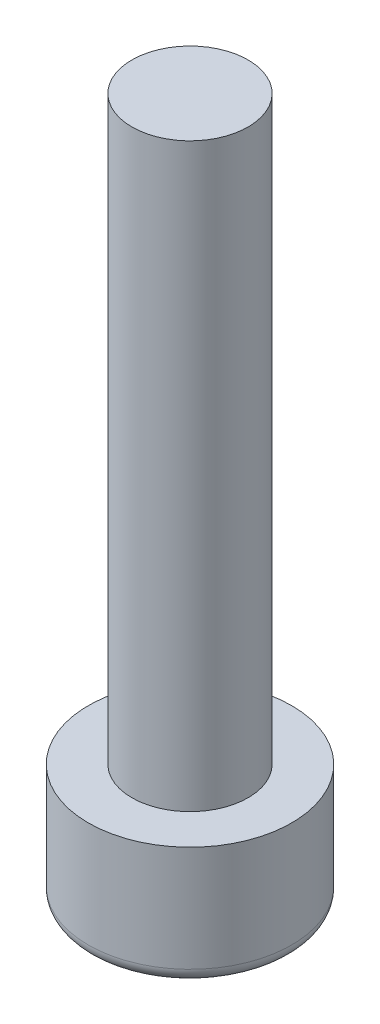
ISO-10303-21;
HEADER;
FILE_DESCRIPTION(('STEP AP214'),'2;1');
FILE_NAME('part.step','',(''),(''),'','','');
FILE_SCHEMA(('AUTOMOTIVE_DESIGN { 1 0 10303 214 1 1 1 1 }'));
ENDSEC;
DATA;
#1=APPLICATION_CONTEXT('core data for automotive mechanical design processes');
#2=APPLICATION_PROTOCOL_DEFINITION('international standard','automotive_design',2000,#1);
#3=PRODUCT_CONTEXT('',#1,'mechanical');
#4=PRODUCT('Part','Part','',(#3));
#5=PRODUCT_RELATED_PRODUCT_CATEGORY('part','',(#4));
#6=PRODUCT_DEFINITION_FORMATION('','',#4);
#7=PRODUCT_DEFINITION_CONTEXT('part definition',#1,'design');
#8=PRODUCT_DEFINITION('design','',#6,#7);
#9=PRODUCT_DEFINITION_SHAPE('','',#8);
#10=(LENGTH_UNIT() NAMED_UNIT(*) SI_UNIT(.MILLI.,.METRE.));
#11=(NAMED_UNIT(*) PLANE_ANGLE_UNIT() SI_UNIT($,.RADIAN.));
#12=(NAMED_UNIT(*) SI_UNIT($,.STERADIAN.) SOLID_ANGLE_UNIT());
#13=UNCERTAINTY_MEASURE_WITH_UNIT(LENGTH_MEASURE(1.E-05),#10,'distance_accuracy_value','');
#14=(GEOMETRIC_REPRESENTATION_CONTEXT(3) GLOBAL_UNCERTAINTY_ASSIGNED_CONTEXT((#13)) GLOBAL_UNIT_ASSIGNED_CONTEXT((#10,
#11,#12)) REPRESENTATION_CONTEXT('',''));
#15=CARTESIAN_POINT('',(0.,0.,0.));
#16=DIRECTION('',(0.,0.,1.));
#17=DIRECTION('',(1.,0.,0.));
#18=AXIS2_PLACEMENT_3D('',#15,#16,#17);
#19=CARTESIAN_POINT('',(0.,4.14,0.));
#20=DIRECTION('',(0.,-1.,0.));
#21=DIRECTION('',(0.,0.,-1.));
#22=AXIS2_PLACEMENT_3D('',#19,#20,#21);
#23=CYLINDRICAL_SURFACE('',#22,3.5);
#24=CARTESIAN_POINT('',(0.,0.5,0.));
#25=DIRECTION('',(0.,1.,0.));
#26=DIRECTION('',(0.,0.,1.));
#27=AXIS2_PLACEMENT_3D('',#24,#25,#26);
#28=CIRCLE('',#27,3.5);
#29=CARTESIAN_POINT('',(0.,0.5,3.5));
#30=VERTEX_POINT('',#29);
#31=EDGE_CURVE('E47',#30,#30,#28,.T.);
#32=ORIENTED_EDGE('',*,*,#31,.T.);
#33=EDGE_LOOP('',(#32));
#34=FACE_BOUND('',#33,.T.);
#35=CARTESIAN_POINT('',(0.,4.14,0.));
#36=DIRECTION('',(0.,1.,0.));
#37=DIRECTION('',(0.,0.,1.));
#38=AXIS2_PLACEMENT_3D('',#35,#36,#37);
#39=CIRCLE('',#38,3.5);
#40=CARTESIAN_POINT('',(0.,4.14,3.5));
#41=VERTEX_POINT('',#40);
#42=EDGE_CURVE('E149',#41,#41,#39,.T.);
#43=ORIENTED_EDGE('',*,*,#42,.F.);
#44=EDGE_LOOP('',(#43));
#45=FACE_BOUND('',#44,.T.);
#46=ADVANCED_FACE('F39',(#34,#45),#23,.T.);
#47=CARTESIAN_POINT('',(0.,4.14,0.));
#48=DIRECTION('',(0.,1.,0.));
#49=DIRECTION('',(0.,0.,1.));
#50=AXIS2_PLACEMENT_3D('',#47,#48,#49);
#51=PLANE('',#50);
#52=CARTESIAN_POINT('',(0.,4.14,0.));
#53=DIRECTION('',(0.,1.,0.));
#54=DIRECTION('',(0.,0.,1.));
#55=AXIS2_PLACEMENT_3D('',#52,#53,#54);
#56=CIRCLE('',#55,2.);
#57=CARTESIAN_POINT('',(0.,4.14,2.));
#58=VERTEX_POINT('',#57);
#59=EDGE_CURVE('E150',#58,#58,#56,.T.);
#60=ORIENTED_EDGE('',*,*,#59,.F.);
#61=EDGE_LOOP('',(#60));
#62=FACE_BOUND('',#61,.T.);
#63=ORIENTED_EDGE('',*,*,#42,.T.);
#64=EDGE_LOOP('',(#63));
#65=FACE_BOUND('',#64,.T.);
#66=ADVANCED_FACE('F174',(#62,#65),#51,.T.);
#67=CARTESIAN_POINT('',(0.,0.,0.));
#68=DIRECTION('',(0.,1.,0.));
#69=DIRECTION('',(0.,0.,1.));
#70=AXIS2_PLACEMENT_3D('',#67,#68,#69);
#71=PLANE('',#70);
#72=DIRECTION('',(-0.986123142284574,0.,0.1660155060553));
#73=VECTOR('',#72,1.);
#74=CARTESIAN_POINT('',(1.69828720758972,0.,2.05607243390784));
#75=LINE('',#74,#73);
#76=CARTESIAN_POINT('',(1.69828720758972,0.,2.05607243390784));
#77=VERTEX_POINT('',#76);
#78=CARTESIAN_POINT('',(-0.931467355990228,0.,2.49879608164875));
#79=VERTEX_POINT('',#78);
#80=EDGE_CURVE('E128',#77,#79,#75,.T.);
#81=ORIENTED_EDGE('',*,*,#80,.F.);
#82=DIRECTION('',(-0.349287925476268,0.,0.937015445505828));
#83=VECTOR('',#82,1.);
#84=CARTESIAN_POINT('',(2.62975456357995,0.,-0.442723647740915));
#85=LINE('',#84,#83);
#86=CARTESIAN_POINT('',(2.62975456357995,0.,-0.442723647740915));
#87=VERTEX_POINT('',#86);
#88=EDGE_CURVE('E54',#87,#77,#85,.T.);
#89=ORIENTED_EDGE('',*,*,#88,.F.);
#90=DIRECTION('',(0.636835216808306,0.,0.770999939450528));
#91=VECTOR('',#90,1.);
#92=CARTESIAN_POINT('',(0.931467355990229,0.,-2.49879608164875));
#93=LINE('',#92,#91);
#94=CARTESIAN_POINT('',(0.931467355990229,0.,-2.49879608164875));
#95=VERTEX_POINT('',#94);
#96=EDGE_CURVE('E137',#95,#87,#93,.T.);
#97=ORIENTED_EDGE('',*,*,#96,.F.);
#98=DIRECTION('',(0.986123142284574,0.,-0.1660155060553));
#99=VECTOR('',#98,1.);
#100=CARTESIAN_POINT('',(-1.69828720758972,0.,-2.05607243390784));
#101=LINE('',#100,#99);
#102=CARTESIAN_POINT('',(-1.69828720758972,0.,-2.05607243390784));
#103=VERTEX_POINT('',#102);
#104=EDGE_CURVE('E135',#103,#95,#101,.T.);
#105=ORIENTED_EDGE('',*,*,#104,.F.);
#106=DIRECTION('',(0.349287925476268,0.,-0.937015445505828));
#107=VECTOR('',#106,1.);
#108=CARTESIAN_POINT('',(-2.62975456357995,0.,0.442723647740914));
#109=LINE('',#108,#107);
#110=CARTESIAN_POINT('',(-2.62975456357995,0.,0.442723647740914));
#111=VERTEX_POINT('',#110);
#112=EDGE_CURVE('E102',#111,#103,#109,.T.);
#113=ORIENTED_EDGE('',*,*,#112,.F.);
#114=DIRECTION('',(-0.636835216808306,0.,-0.770999939450528));
#115=VECTOR('',#114,1.);
#116=CARTESIAN_POINT('',(-0.931467355990228,0.,2.49879608164875));
#117=LINE('',#116,#115);
#118=EDGE_CURVE('E131',#79,#111,#117,.T.);
#119=ORIENTED_EDGE('',*,*,#118,.F.);
#120=EDGE_LOOP('',(#81,#89,#97,#105,#113,#119));
#121=FACE_BOUND('',#120,.T.);
#122=CARTESIAN_POINT('',(0.,0.,0.));
#123=DIRECTION('',(0.,1.,0.));
#124=DIRECTION('',(0.,0.,1.));
#125=AXIS2_PLACEMENT_3D('',#122,#123,#124);
#126=CIRCLE('',#125,3.);
#127=CARTESIAN_POINT('',(0.,0.,3.));
#128=VERTEX_POINT('',#127);
#129=EDGE_CURVE('E11',#128,#128,#126,.F.);
#130=ORIENTED_EDGE('',*,*,#129,.T.);
#131=EDGE_LOOP('',(#130));
#132=FACE_BOUND('',#131,.T.);
#133=ADVANCED_FACE('F178',(#121,#132),#71,.F.);
#134=CARTESIAN_POINT('',(0.,24.14,0.));
#135=DIRECTION('',(0.,-1.,0.));
#136=DIRECTION('',(0.,0.,-1.));
#137=AXIS2_PLACEMENT_3D('',#134,#135,#136);
#138=CYLINDRICAL_SURFACE('',#137,2.);
#139=CARTESIAN_POINT('',(0.,24.14,0.));
#140=DIRECTION('',(0.,1.,0.));
#141=DIRECTION('',(0.,0.,1.));
#142=AXIS2_PLACEMENT_3D('',#139,#140,#141);
#143=CIRCLE('',#142,2.);
#144=CARTESIAN_POINT('',(0.,24.14,2.));
#145=VERTEX_POINT('',#144);
#146=EDGE_CURVE('E141',#145,#145,#143,.T.);
#147=ORIENTED_EDGE('',*,*,#146,.F.);
#148=EDGE_LOOP('',(#147));
#149=FACE_BOUND('',#148,.T.);
#150=ORIENTED_EDGE('',*,*,#59,.T.);
#151=EDGE_LOOP('',(#150));
#152=FACE_BOUND('',#151,.T.);
#153=ADVANCED_FACE('F169',(#149,#152),#138,.T.);
#154=CARTESIAN_POINT('',(0.,24.14,0.));
#155=DIRECTION('',(0.,1.,0.));
#156=DIRECTION('',(0.,0.,1.));
#157=AXIS2_PLACEMENT_3D('',#154,#155,#156);
#158=PLANE('',#157);
#159=ORIENTED_EDGE('',*,*,#146,.T.);
#160=EDGE_LOOP('',(#159));
#161=FACE_BOUND('',#160,.T.);
#162=ADVANCED_FACE('F161',(#161),#158,.T.);
#163=CARTESIAN_POINT('',(0.,0.5,0.));
#164=DIRECTION('',(0.,1.,0.));
#165=DIRECTION('',(0.,0.,1.));
#166=AXIS2_PLACEMENT_3D('',#163,#164,#165);
#167=TOROIDAL_SURFACE('',#166,3.,0.5);
#168=ORIENTED_EDGE('',*,*,#129,.F.);
#169=EDGE_LOOP('',(#168));
#170=FACE_BOUND('',#169,.T.);
#171=ORIENTED_EDGE('',*,*,#31,.F.);
#172=EDGE_LOOP('',(#171));
#173=FACE_BOUND('',#172,.T.);
#174=ADVANCED_FACE('F41',(#170,#173),#167,.T.);
#175=CARTESIAN_POINT('',(2.62975456357995,2.,-0.442723647740915));
#176=DIRECTION('',(0.937015445505828,0.,0.349287925476268));
#177=DIRECTION('',(0.349287925476268,0.,-0.937015445505828));
#178=AXIS2_PLACEMENT_3D('',#175,#176,#177);
#179=PLANE('',#178);
#180=ORIENTED_EDGE('',*,*,#88,.T.);
#181=DIRECTION('',(0.,-1.,0.));
#182=VECTOR('',#181,1.);
#183=CARTESIAN_POINT('',(1.69828720758972,2.,2.05607243390784));
#184=LINE('',#183,#182);
#185=CARTESIAN_POINT('',(1.69828720758972,2.,2.05607243390784));
#186=VERTEX_POINT('',#185);
#187=EDGE_CURVE('E84',#186,#77,#184,.T.);
#188=ORIENTED_EDGE('',*,*,#187,.F.);
#189=DIRECTION('',(-0.349287925476268,0.,0.937015445505828));
#190=VECTOR('',#189,1.);
#191=CARTESIAN_POINT('',(2.62975456357995,2.,-0.442723647740915));
#192=LINE('',#191,#190);
#193=CARTESIAN_POINT('',(2.62975456357995,2.,-0.442723647740915));
#194=VERTEX_POINT('',#193);
#195=EDGE_CURVE('E139',#194,#186,#192,.T.);
#196=ORIENTED_EDGE('',*,*,#195,.F.);
#197=DIRECTION('',(0.,-1.,0.));
#198=VECTOR('',#197,1.);
#199=CARTESIAN_POINT('',(2.62975456357995,2.,-0.442723647740915));
#200=LINE('',#199,#198);
#201=EDGE_CURVE('E62',#194,#87,#200,.T.);
#202=ORIENTED_EDGE('',*,*,#201,.T.);
#203=EDGE_LOOP('',(#180,#188,#196,#202));
#204=FACE_BOUND('',#203,.T.);
#205=ADVANCED_FACE('F160',(#204),#179,.F.);
#206=CARTESIAN_POINT('',(0.931467355990229,2.,-2.49879608164875));
#207=DIRECTION('',(0.770999939450528,0.,-0.636835216808306));
#208=DIRECTION('',(-0.636835216808306,0.,-0.770999939450528));
#209=AXIS2_PLACEMENT_3D('',#206,#207,#208);
#210=PLANE('',#209);
#211=ORIENTED_EDGE('',*,*,#96,.T.);
#212=ORIENTED_EDGE('',*,*,#201,.F.);
#213=DIRECTION('',(0.636835216808306,0.,0.770999939450528));
#214=VECTOR('',#213,1.);
#215=CARTESIAN_POINT('',(0.931467355990229,2.,-2.49879608164875));
#216=LINE('',#215,#214);
#217=CARTESIAN_POINT('',(0.931467355990229,2.,-2.49879608164875));
#218=VERTEX_POINT('',#217);
#219=EDGE_CURVE('E114',#218,#194,#216,.T.);
#220=ORIENTED_EDGE('',*,*,#219,.F.);
#221=DIRECTION('',(0.,-1.,0.));
#222=VECTOR('',#221,1.);
#223=CARTESIAN_POINT('',(0.931467355990229,2.,-2.49879608164875));
#224=LINE('',#223,#222);
#225=EDGE_CURVE('E106',#218,#95,#224,.T.);
#226=ORIENTED_EDGE('',*,*,#225,.T.);
#227=EDGE_LOOP('',(#211,#212,#220,#226));
#228=FACE_BOUND('',#227,.T.);
#229=ADVANCED_FACE('F167',(#228),#210,.F.);
#230=CARTESIAN_POINT('',(-1.69828720758972,2.,-2.05607243390784));
#231=DIRECTION('',(-0.1660155060553,0.,-0.986123142284574));
#232=DIRECTION('',(-0.986123142284574,0.,0.1660155060553));
#233=AXIS2_PLACEMENT_3D('',#230,#231,#232);
#234=PLANE('',#233);
#235=ORIENTED_EDGE('',*,*,#104,.T.);
#236=ORIENTED_EDGE('',*,*,#225,.F.);
#237=DIRECTION('',(0.986123142284574,0.,-0.1660155060553));
#238=VECTOR('',#237,1.);
#239=CARTESIAN_POINT('',(-1.69828720758972,2.,-2.05607243390784));
#240=LINE('',#239,#238);
#241=CARTESIAN_POINT('',(-1.69828720758972,2.,-2.05607243390784));
#242=VERTEX_POINT('',#241);
#243=EDGE_CURVE('E110',#242,#218,#240,.T.);
#244=ORIENTED_EDGE('',*,*,#243,.F.);
#245=DIRECTION('',(0.,-1.,0.));
#246=VECTOR('',#245,1.);
#247=CARTESIAN_POINT('',(-1.69828720758972,2.,-2.05607243390784));
#248=LINE('',#247,#246);
#249=EDGE_CURVE('E95',#242,#103,#248,.T.);
#250=ORIENTED_EDGE('',*,*,#249,.T.);
#251=EDGE_LOOP('',(#235,#236,#244,#250));
#252=FACE_BOUND('',#251,.T.);
#253=ADVANCED_FACE('F111',(#252),#234,.F.);
#254=CARTESIAN_POINT('',(-2.62975456357995,2.,0.442723647740914));
#255=DIRECTION('',(-0.937015445505828,0.,-0.349287925476268));
#256=DIRECTION('',(-0.349287925476268,0.,0.937015445505828));
#257=AXIS2_PLACEMENT_3D('',#254,#255,#256);
#258=PLANE('',#257);
#259=ORIENTED_EDGE('',*,*,#112,.T.);
#260=ORIENTED_EDGE('',*,*,#249,.F.);
#261=DIRECTION('',(0.349287925476268,0.,-0.937015445505828));
#262=VECTOR('',#261,1.);
#263=CARTESIAN_POINT('',(-2.62975456357995,2.,0.442723647740914));
#264=LINE('',#263,#262);
#265=CARTESIAN_POINT('',(-2.62975456357995,2.,0.442723647740914));
#266=VERTEX_POINT('',#265);
#267=EDGE_CURVE('E99',#266,#242,#264,.T.);
#268=ORIENTED_EDGE('',*,*,#267,.F.);
#269=DIRECTION('',(0.,-1.,0.));
#270=VECTOR('',#269,1.);
#271=CARTESIAN_POINT('',(-2.62975456357995,2.,0.442723647740914));
#272=LINE('',#271,#270);
#273=EDGE_CURVE('E107',#266,#111,#272,.T.);
#274=ORIENTED_EDGE('',*,*,#273,.T.);
#275=EDGE_LOOP('',(#259,#260,#268,#274));
#276=FACE_BOUND('',#275,.T.);
#277=ADVANCED_FACE('F97',(#276),#258,.F.);
#278=CARTESIAN_POINT('',(-0.931467355990228,2.,2.49879608164875));
#279=DIRECTION('',(-0.770999939450528,0.,0.636835216808306));
#280=DIRECTION('',(0.636835216808306,0.,0.770999939450528));
#281=AXIS2_PLACEMENT_3D('',#278,#279,#280);
#282=PLANE('',#281);
#283=ORIENTED_EDGE('',*,*,#118,.T.);
#284=ORIENTED_EDGE('',*,*,#273,.F.);
#285=DIRECTION('',(-0.636835216808306,0.,-0.770999939450528));
#286=VECTOR('',#285,1.);
#287=CARTESIAN_POINT('',(-0.931467355990228,2.,2.49879608164875));
#288=LINE('',#287,#286);
#289=CARTESIAN_POINT('',(-0.931467355990228,2.,2.49879608164875));
#290=VERTEX_POINT('',#289);
#291=EDGE_CURVE('E120',#290,#266,#288,.T.);
#292=ORIENTED_EDGE('',*,*,#291,.F.);
#293=DIRECTION('',(0.,-1.,0.));
#294=VECTOR('',#293,1.);
#295=CARTESIAN_POINT('',(-0.931467355990228,2.,2.49879608164875));
#296=LINE('',#295,#294);
#297=EDGE_CURVE('E144',#290,#79,#296,.T.);
#298=ORIENTED_EDGE('',*,*,#297,.T.);
#299=EDGE_LOOP('',(#283,#284,#292,#298));
#300=FACE_BOUND('',#299,.T.);
#301=ADVANCED_FACE('F191',(#300),#282,.F.);
#302=CARTESIAN_POINT('',(1.69828720758972,2.,2.05607243390784));
#303=DIRECTION('',(0.1660155060553,0.,0.986123142284574));
#304=DIRECTION('',(0.986123142284574,0.,-0.1660155060553));
#305=AXIS2_PLACEMENT_3D('',#302,#303,#304);
#306=PLANE('',#305);
#307=ORIENTED_EDGE('',*,*,#80,.T.);
#308=ORIENTED_EDGE('',*,*,#297,.F.);
#309=DIRECTION('',(-0.986123142284574,0.,0.1660155060553));
#310=VECTOR('',#309,1.);
#311=CARTESIAN_POINT('',(1.69828720758972,2.,2.05607243390784));
#312=LINE('',#311,#310);
#313=EDGE_CURVE('E122',#186,#290,#312,.T.);
#314=ORIENTED_EDGE('',*,*,#313,.F.);
#315=ORIENTED_EDGE('',*,*,#187,.T.);
#316=EDGE_LOOP('',(#307,#308,#314,#315));
#317=FACE_BOUND('',#316,.T.);
#318=ADVANCED_FACE('F188',(#317),#306,.F.);
#319=CARTESIAN_POINT('',(0.,2.,0.));
#320=DIRECTION('',(0.,-1.,0.));
#321=DIRECTION('',(0.,0.,-1.));
#322=AXIS2_PLACEMENT_3D('',#319,#320,#321);
#323=PLANE('',#322);
#324=ORIENTED_EDGE('',*,*,#195,.T.);
#325=ORIENTED_EDGE('',*,*,#313,.T.);
#326=ORIENTED_EDGE('',*,*,#291,.T.);
#327=ORIENTED_EDGE('',*,*,#267,.T.);
#328=ORIENTED_EDGE('',*,*,#243,.T.);
#329=ORIENTED_EDGE('',*,*,#219,.T.);
#330=EDGE_LOOP('',(#324,#325,#326,#327,#328,#329));
#331=FACE_BOUND('',#330,.T.);
#332=ADVANCED_FACE('F117',(#331),#323,.T.);
#333=CLOSED_SHELL('',(#46,#66,#133,#153,#162,#174,#205,#229,#253,#277,#301,#318,#332));
#334=MANIFOLD_SOLID_BREP('B2',#333);
#335=ADVANCED_BREP_SHAPE_REPRESENTATION('',(#18,#334),#14);
#336=SHAPE_DEFINITION_REPRESENTATION(#9,#335);
ENDSEC;
END-ISO-10303-21;
